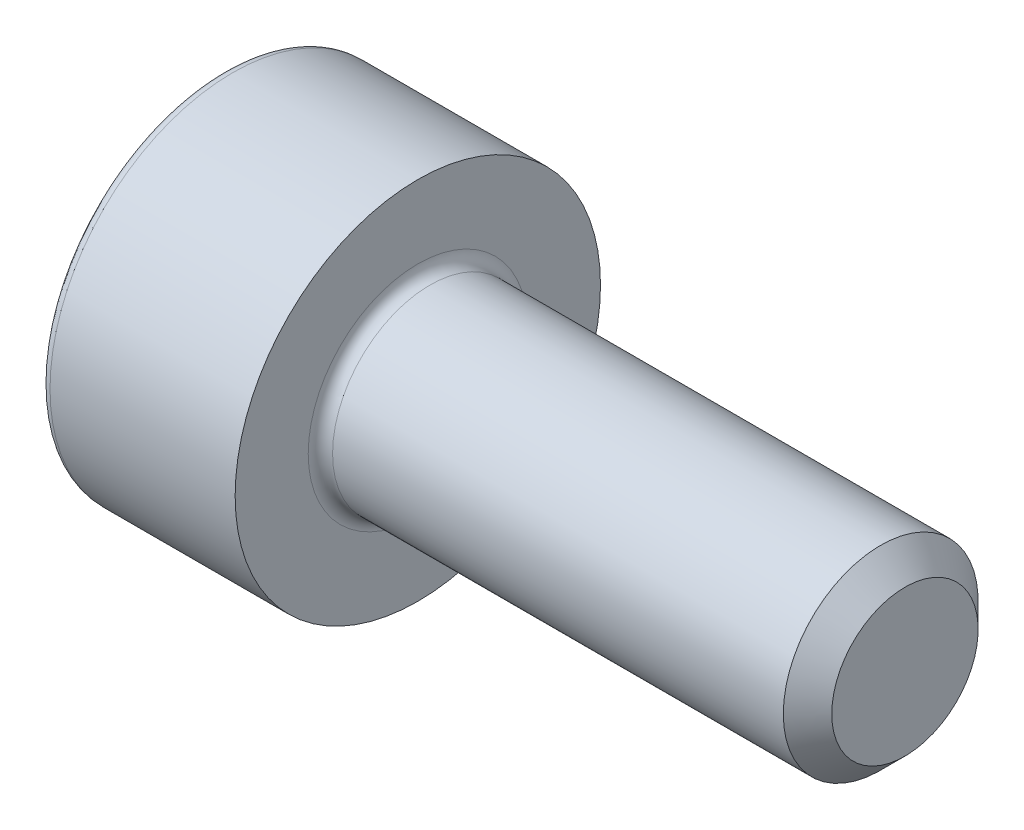
ISO-10303-21;
HEADER;
FILE_DESCRIPTION(('STEP AP214'),'2;1');
FILE_NAME('part.step','',(''),(''),'','','');
FILE_SCHEMA(('AUTOMOTIVE_DESIGN { 1 0 10303 214 1 1 1 1 }'));
ENDSEC;
DATA;
#1=APPLICATION_CONTEXT('core data for automotive mechanical design processes');
#2=APPLICATION_PROTOCOL_DEFINITION('international standard','automotive_design',2000,#1);
#3=PRODUCT_CONTEXT('',#1,'mechanical');
#4=PRODUCT('Part','Part','',(#3));
#5=PRODUCT_RELATED_PRODUCT_CATEGORY('part','',(#4));
#6=PRODUCT_DEFINITION_FORMATION('','',#4);
#7=PRODUCT_DEFINITION_CONTEXT('part definition',#1,'design');
#8=PRODUCT_DEFINITION('design','',#6,#7);
#9=PRODUCT_DEFINITION_SHAPE('','',#8);
#10=(LENGTH_UNIT() NAMED_UNIT(*) SI_UNIT(.MILLI.,.METRE.));
#11=(NAMED_UNIT(*) PLANE_ANGLE_UNIT() SI_UNIT($,.RADIAN.));
#12=(NAMED_UNIT(*) SI_UNIT($,.STERADIAN.) SOLID_ANGLE_UNIT());
#13=UNCERTAINTY_MEASURE_WITH_UNIT(LENGTH_MEASURE(1.E-05),#10,'distance_accuracy_value','');
#14=(GEOMETRIC_REPRESENTATION_CONTEXT(3) GLOBAL_UNCERTAINTY_ASSIGNED_CONTEXT((#13)) GLOBAL_UNIT_ASSIGNED_CONTEXT((#10,
#11,#12)) REPRESENTATION_CONTEXT('',''));
#15=CARTESIAN_POINT('',(0.,0.,0.));
#16=DIRECTION('',(0.,0.,1.));
#17=DIRECTION('',(1.,0.,0.));
#18=AXIS2_PLACEMENT_3D('',#15,#16,#17);
#19=CARTESIAN_POINT('',(0.7,0.433012701892219,-0.75));
#20=DIRECTION('',(-1.,0.,0.));
#21=DIRECTION('',(0.,0.,1.));
#22=AXIS2_PLACEMENT_3D('',#19,#20,#21);
#23=PLANE('',#22);
#24=DIRECTION('',(0.,-1.,0.));
#25=VECTOR('',#24,1.);
#26=CARTESIAN_POINT('',(0.7,0.43301270189222,0.75));
#27=LINE('',#26,#25);
#28=CARTESIAN_POINT('',(0.7,0.,0.75));
#29=VERTEX_POINT('',#28);
#30=CARTESIAN_POINT('',(0.7,-0.433012701892219,0.75));
#31=VERTEX_POINT('',#30);
#32=EDGE_CURVE('E166',#29,#31,#27,.T.);
#33=ORIENTED_EDGE('',*,*,#32,.F.);
#34=CARTESIAN_POINT('',(0.7,0.,0.));
#35=DIRECTION('',(-1.,0.,0.));
#36=DIRECTION('',(0.,0.,1.));
#37=AXIS2_PLACEMENT_3D('',#34,#35,#36);
#38=CIRCLE('',#37,0.75);
#39=CARTESIAN_POINT('',(0.7,-0.649519052838329,0.375));
#40=VERTEX_POINT('',#39);
#41=EDGE_CURVE('E11',#29,#40,#38,.F.);
#42=ORIENTED_EDGE('',*,*,#41,.T.);
#43=DIRECTION('',(0.,-0.5,-0.866025403784438));
#44=VECTOR('',#43,1.);
#45=CARTESIAN_POINT('',(0.7,-0.433012701892219,0.75));
#46=LINE('',#45,#44);
#47=EDGE_CURVE('E172',#31,#40,#46,.T.);
#48=ORIENTED_EDGE('',*,*,#47,.F.);
#49=EDGE_LOOP('',(#33,#42,#48));
#50=FACE_BOUND('',#49,.T.);
#51=ADVANCED_FACE('F39',(#50),#23,.T.);
#52=CARTESIAN_POINT('',(0.7,-0.866025403784439,0.));
#53=VERTEX_POINT('',#52);
#54=EDGE_CURVE('E171',#40,#53,#46,.T.);
#55=ORIENTED_EDGE('',*,*,#54,.F.);
#56=CARTESIAN_POINT('',(0.7,-0.649519052838329,-0.375));
#57=VERTEX_POINT('',#56);
#58=EDGE_CURVE('E47',#40,#57,#38,.F.);
#59=ORIENTED_EDGE('',*,*,#58,.T.);
#60=DIRECTION('',(0.,0.5,-0.866025403784439));
#61=VECTOR('',#60,1.);
#62=CARTESIAN_POINT('',(0.7,-0.866025403784439,0.));
#63=LINE('',#62,#61);
#64=EDGE_CURVE('E176',#53,#57,#63,.T.);
#65=ORIENTED_EDGE('',*,*,#64,.F.);
#66=EDGE_LOOP('',(#55,#59,#65));
#67=FACE_BOUND('',#66,.T.);
#68=ADVANCED_FACE('F122',(#67),#23,.T.);
#69=CARTESIAN_POINT('',(0.7,-0.43301270189222,-0.75));
#70=VERTEX_POINT('',#69);
#71=EDGE_CURVE('E175',#57,#70,#63,.T.);
#72=ORIENTED_EDGE('',*,*,#71,.F.);
#73=CARTESIAN_POINT('',(0.7,0.,-0.75));
#74=VERTEX_POINT('',#73);
#75=EDGE_CURVE('E233',#57,#74,#38,.F.);
#76=ORIENTED_EDGE('',*,*,#75,.T.);
#77=DIRECTION('',(0.,1.,0.));
#78=VECTOR('',#77,1.);
#79=CARTESIAN_POINT('',(0.7,-0.43301270189222,-0.75));
#80=LINE('',#79,#78);
#81=EDGE_CURVE('E180',#70,#74,#80,.T.);
#82=ORIENTED_EDGE('',*,*,#81,.F.);
#83=EDGE_LOOP('',(#72,#76,#82));
#84=FACE_BOUND('',#83,.T.);
#85=ADVANCED_FACE('F129',(#84),#23,.T.);
#86=CARTESIAN_POINT('',(0.7,0.43301270189222,-0.75));
#87=VERTEX_POINT('',#86);
#88=EDGE_CURVE('E179',#74,#87,#80,.T.);
#89=ORIENTED_EDGE('',*,*,#88,.F.);
#90=CARTESIAN_POINT('',(0.7,0.649519052838329,-0.375));
#91=VERTEX_POINT('',#90);
#92=EDGE_CURVE('E231',#74,#91,#38,.F.);
#93=ORIENTED_EDGE('',*,*,#92,.T.);
#94=DIRECTION('',(0.,0.5,0.866025403784439));
#95=VECTOR('',#94,1.);
#96=CARTESIAN_POINT('',(0.7,0.43301270189222,-0.75));
#97=LINE('',#96,#95);
#98=EDGE_CURVE('E156',#87,#91,#97,.T.);
#99=ORIENTED_EDGE('',*,*,#98,.F.);
#100=EDGE_LOOP('',(#89,#93,#99));
#101=FACE_BOUND('',#100,.T.);
#102=ADVANCED_FACE('F143',(#101),#23,.T.);
#103=CARTESIAN_POINT('',(0.7,0.866025403784439,0.));
#104=VERTEX_POINT('',#103);
#105=EDGE_CURVE('E195',#91,#104,#97,.T.);
#106=ORIENTED_EDGE('',*,*,#105,.F.);
#107=CARTESIAN_POINT('',(0.7,0.649519052838329,0.375));
#108=VERTEX_POINT('',#107);
#109=EDGE_CURVE('E48',#91,#108,#38,.F.);
#110=ORIENTED_EDGE('',*,*,#109,.T.);
#111=DIRECTION('',(0.,-0.5,0.866025403784439));
#112=VECTOR('',#111,1.);
#113=CARTESIAN_POINT('',(0.7,0.866025403784439,0.));
#114=LINE('',#113,#112);
#115=EDGE_CURVE('E155',#104,#108,#114,.T.);
#116=ORIENTED_EDGE('',*,*,#115,.F.);
#117=EDGE_LOOP('',(#106,#110,#116));
#118=FACE_BOUND('',#117,.T.);
#119=ADVANCED_FACE('F134',(#118),#23,.T.);
#120=CARTESIAN_POINT('',(0.7,0.43301270189222,0.75));
#121=VERTEX_POINT('',#120);
#122=EDGE_CURVE('E147',#108,#121,#114,.T.);
#123=ORIENTED_EDGE('',*,*,#122,.F.);
#124=CARTESIAN_POINT('',(0.7,0.,0.));
#125=DIRECTION('',(-1.,0.,0.));
#126=DIRECTION('',(0.,0.,1.));
#127=AXIS2_PLACEMENT_3D('',#124,#125,#126);
#128=CIRCLE('',#127,0.75);
#129=EDGE_CURVE('E149',#29,#108,#128,.T.);
#130=ORIENTED_EDGE('',*,*,#129,.F.);
#131=EDGE_CURVE('E151',#121,#29,#27,.T.);
#132=ORIENTED_EDGE('',*,*,#131,.F.);
#133=EDGE_LOOP('',(#123,#130,#132));
#134=FACE_BOUND('',#133,.T.);
#135=ADVANCED_FACE('F124',(#134),#23,.T.);
#136=CARTESIAN_POINT('',(0.,0.,0.));
#137=DIRECTION('',(1.,0.,0.));
#138=DIRECTION('',(0.,0.,-1.));
#139=AXIS2_PLACEMENT_3D('',#136,#137,#138);
#140=PLANE('',#139);
#141=CARTESIAN_POINT('',(0.,0.,0.));
#142=DIRECTION('',(1.,0.,0.));
#143=DIRECTION('',(0.,0.,-1.));
#144=AXIS2_PLACEMENT_3D('',#141,#142,#143);
#145=CIRCLE('',#144,1.42);
#146=CARTESIAN_POINT('',(0.,0.,-1.42));
#147=VERTEX_POINT('',#146);
#148=EDGE_CURVE('E225',#147,#147,#145,.F.);
#149=ORIENTED_EDGE('',*,*,#148,.T.);
#150=EDGE_LOOP('',(#149));
#151=FACE_BOUND('',#150,.T.);
#152=DIRECTION('',(0.,0.5,0.866025403784439));
#153=VECTOR('',#152,1.);
#154=CARTESIAN_POINT('',(0.,0.43301270189222,-0.75));
#155=LINE('',#154,#153);
#156=CARTESIAN_POINT('',(0.,0.43301270189222,-0.75));
#157=VERTEX_POINT('',#156);
#158=CARTESIAN_POINT('',(0.,0.866025403784439,0.));
#159=VERTEX_POINT('',#158);
#160=EDGE_CURVE('E184',#157,#159,#155,.T.);
#161=ORIENTED_EDGE('',*,*,#160,.T.);
#162=DIRECTION('',(0.,-0.5,0.866025403784439));
#163=VECTOR('',#162,1.);
#164=CARTESIAN_POINT('',(0.,0.866025403784439,0.));
#165=LINE('',#164,#163);
#166=CARTESIAN_POINT('',(0.,0.43301270189222,0.75));
#167=VERTEX_POINT('',#166);
#168=EDGE_CURVE('E186',#159,#167,#165,.T.);
#169=ORIENTED_EDGE('',*,*,#168,.T.);
#170=DIRECTION('',(0.,-1.,0.));
#171=VECTOR('',#170,1.);
#172=CARTESIAN_POINT('',(0.,0.43301270189222,0.75));
#173=LINE('',#172,#171);
#174=CARTESIAN_POINT('',(0.,-0.433012701892219,0.75));
#175=VERTEX_POINT('',#174);
#176=EDGE_CURVE('E188',#167,#175,#173,.T.);
#177=ORIENTED_EDGE('',*,*,#176,.T.);
#178=DIRECTION('',(0.,-0.5,-0.866025403784438));
#179=VECTOR('',#178,1.);
#180=CARTESIAN_POINT('',(0.,-0.433012701892219,0.75));
#181=LINE('',#180,#179);
#182=CARTESIAN_POINT('',(0.,-0.866025403784439,0.));
#183=VERTEX_POINT('',#182);
#184=EDGE_CURVE('E190',#175,#183,#181,.T.);
#185=ORIENTED_EDGE('',*,*,#184,.T.);
#186=DIRECTION('',(0.,0.5,-0.866025403784439));
#187=VECTOR('',#186,1.);
#188=CARTESIAN_POINT('',(0.,-0.866025403784439,0.));
#189=LINE('',#188,#187);
#190=CARTESIAN_POINT('',(0.,-0.43301270189222,-0.75));
#191=VERTEX_POINT('',#190);
#192=EDGE_CURVE('E192',#183,#191,#189,.T.);
#193=ORIENTED_EDGE('',*,*,#192,.T.);
#194=DIRECTION('',(0.,1.,0.));
#195=VECTOR('',#194,1.);
#196=CARTESIAN_POINT('',(0.,-0.43301270189222,-0.75));
#197=LINE('',#196,#195);
#198=EDGE_CURVE('E61',#191,#157,#197,.T.);
#199=ORIENTED_EDGE('',*,*,#198,.T.);
#200=EDGE_LOOP('',(#161,#169,#177,#185,#193,#199));
#201=FACE_BOUND('',#200,.T.);
#202=ADVANCED_FACE('F133',(#151,#201),#140,.F.);
#203=CARTESIAN_POINT('',(0.,0.,0.));
#204=DIRECTION('',(-1.,0.,0.));
#205=DIRECTION('',(0.,0.,1.));
#206=AXIS2_PLACEMENT_3D('',#203,#204,#205);
#207=CYLINDRICAL_SURFACE('',#206,1.5);
#208=CARTESIAN_POINT('',(0.08,0.,0.));
#209=DIRECTION('',(1.,0.,0.));
#210=DIRECTION('',(0.,0.,-1.));
#211=AXIS2_PLACEMENT_3D('',#208,#209,#210);
#212=CIRCLE('',#211,1.5);
#213=CARTESIAN_POINT('',(0.08,0.,-1.5));
#214=VERTEX_POINT('',#213);
#215=EDGE_CURVE('E227',#214,#214,#212,.T.);
#216=ORIENTED_EDGE('',*,*,#215,.T.);
#217=EDGE_LOOP('',(#216));
#218=FACE_BOUND('',#217,.T.);
#219=CARTESIAN_POINT('',(1.6,0.,0.));
#220=DIRECTION('',(-1.,0.,0.));
#221=DIRECTION('',(0.,0.,1.));
#222=AXIS2_PLACEMENT_3D('',#219,#220,#221);
#223=CIRCLE('',#222,1.5);
#224=CARTESIAN_POINT('',(1.6,0.,1.5));
#225=VERTEX_POINT('',#224);
#226=EDGE_CURVE('E216',#225,#225,#223,.T.);
#227=ORIENTED_EDGE('',*,*,#226,.T.);
#228=EDGE_LOOP('',(#227));
#229=FACE_BOUND('',#228,.T.);
#230=ADVANCED_FACE('F140',(#218,#229),#207,.T.);
#231=CARTESIAN_POINT('',(1.6,1.5,0.));
#232=DIRECTION('',(-1.,0.,0.));
#233=DIRECTION('',(0.,0.,1.));
#234=AXIS2_PLACEMENT_3D('',#231,#232,#233);
#235=PLANE('',#234);
#236=CARTESIAN_POINT('',(1.6,0.,0.));
#237=DIRECTION('',(-1.,0.,0.));
#238=DIRECTION('',(0.,0.,1.));
#239=AXIS2_PLACEMENT_3D('',#236,#237,#238);
#240=CIRCLE('',#239,0.9);
#241=CARTESIAN_POINT('',(1.6,0.,0.9));
#242=VERTEX_POINT('',#241);
#243=EDGE_CURVE('E219',#242,#242,#240,.T.);
#244=ORIENTED_EDGE('',*,*,#243,.T.);
#245=EDGE_LOOP('',(#244));
#246=FACE_BOUND('',#245,.T.);
#247=ORIENTED_EDGE('',*,*,#226,.F.);
#248=EDGE_LOOP('',(#247));
#249=FACE_BOUND('',#248,.T.);
#250=ADVANCED_FACE('F393',(#246,#249),#235,.F.);
#251=CARTESIAN_POINT('',(0.,0.,0.));
#252=DIRECTION('',(-1.,0.,0.));
#253=DIRECTION('',(0.,0.,1.));
#254=AXIS2_PLACEMENT_3D('',#251,#252,#253);
#255=CYLINDRICAL_SURFACE('',#254,0.8);
#256=CARTESIAN_POINT('',(1.7,0.,0.));
#257=DIRECTION('',(-1.,0.,0.));
#258=DIRECTION('',(0.,0.,1.));
#259=AXIS2_PLACEMENT_3D('',#256,#257,#258);
#260=CIRCLE('',#259,0.8);
#261=CARTESIAN_POINT('',(1.7,0.,0.8));
#262=VERTEX_POINT('',#261);
#263=EDGE_CURVE('E222',#262,#262,#260,.F.);
#264=ORIENTED_EDGE('',*,*,#263,.T.);
#265=EDGE_LOOP('',(#264));
#266=FACE_BOUND('',#265,.T.);
#267=CARTESIAN_POINT('',(5.401,0.,0.));
#268=DIRECTION('',(-1.,0.,0.));
#269=DIRECTION('',(0.,0.,1.));
#270=AXIS2_PLACEMENT_3D('',#267,#268,#269);
#271=CIRCLE('',#270,0.8);
#272=CARTESIAN_POINT('',(5.401,0.,0.8));
#273=VERTEX_POINT('',#272);
#274=EDGE_CURVE('E213',#273,#273,#271,.T.);
#275=ORIENTED_EDGE('',*,*,#274,.T.);
#276=EDGE_LOOP('',(#275));
#277=FACE_BOUND('',#276,.T.);
#278=ADVANCED_FACE('F384',(#266,#277),#255,.T.);
#279=CARTESIAN_POINT('',(5.6,0.,0.));
#280=DIRECTION('',(-1.,0.,0.));
#281=DIRECTION('',(0.,0.,1.));
#282=AXIS2_PLACEMENT_3D('',#279,#280,#281);
#283=CONICAL_SURFACE('',#282,0.601,0.785398163397452);
#284=ORIENTED_EDGE('',*,*,#274,.F.);
#285=EDGE_LOOP('',(#284));
#286=FACE_BOUND('',#285,.T.);
#287=CARTESIAN_POINT('',(5.6,0.,0.));
#288=DIRECTION('',(-1.,0.,0.));
#289=DIRECTION('',(0.,0.,1.));
#290=AXIS2_PLACEMENT_3D('',#287,#288,#289);
#291=CIRCLE('',#290,0.601);
#292=CARTESIAN_POINT('',(5.6,0.,0.601));
#293=VERTEX_POINT('',#292);
#294=EDGE_CURVE('E210',#293,#293,#291,.T.);
#295=ORIENTED_EDGE('',*,*,#294,.T.);
#296=EDGE_LOOP('',(#295));
#297=FACE_BOUND('',#296,.T.);
#298=ADVANCED_FACE('F373',(#286,#297),#283,.T.);
#299=CARTESIAN_POINT('',(5.6,0.601,0.));
#300=DIRECTION('',(-1.,0.,0.));
#301=DIRECTION('',(0.,0.,1.));
#302=AXIS2_PLACEMENT_3D('',#299,#300,#301);
#303=PLANE('',#302);
#304=ORIENTED_EDGE('',*,*,#294,.F.);
#305=EDGE_LOOP('',(#304));
#306=FACE_BOUND('',#305,.T.);
#307=ADVANCED_FACE('F363',(#306),#303,.F.);
#308=CARTESIAN_POINT('',(1.7,0.,0.));
#309=DIRECTION('',(-1.,0.,0.));
#310=DIRECTION('',(0.,0.,1.));
#311=AXIS2_PLACEMENT_3D('',#308,#309,#310);
#312=TOROIDAL_SURFACE('',#311,0.9,0.1);
#313=ORIENTED_EDGE('',*,*,#263,.F.);
#314=EDGE_LOOP('',(#313));
#315=FACE_BOUND('',#314,.T.);
#316=ORIENTED_EDGE('',*,*,#243,.F.);
#317=EDGE_LOOP('',(#316));
#318=FACE_BOUND('',#317,.T.);
#319=ADVANCED_FACE('F353',(#315,#318),#312,.F.);
#320=CARTESIAN_POINT('',(0.08,0.,0.));
#321=DIRECTION('',(1.,0.,0.));
#322=DIRECTION('',(0.,0.,-1.));
#323=AXIS2_PLACEMENT_3D('',#320,#321,#322);
#324=TOROIDAL_SURFACE('',#323,1.42,0.08);
#325=ORIENTED_EDGE('',*,*,#215,.F.);
#326=EDGE_LOOP('',(#325));
#327=FACE_BOUND('',#326,.T.);
#328=ORIENTED_EDGE('',*,*,#148,.F.);
#329=EDGE_LOOP('',(#328));
#330=FACE_BOUND('',#329,.T.);
#331=ADVANCED_FACE('F41',(#327,#330),#324,.T.);
#332=CARTESIAN_POINT('',(0.7,0.43301270189222,-0.75));
#333=DIRECTION('',(0.,-0.866025403784439,0.5));
#334=DIRECTION('',(0.,-0.5,-0.866025403784439));
#335=AXIS2_PLACEMENT_3D('',#332,#333,#334);
#336=PLANE('',#335);
#337=ORIENTED_EDGE('',*,*,#98,.T.);
#338=ORIENTED_EDGE('',*,*,#105,.T.);
#339=DIRECTION('',(-1.,0.,0.));
#340=VECTOR('',#339,1.);
#341=CARTESIAN_POINT('',(0.7,0.866025403784439,0.));
#342=LINE('',#341,#340);
#343=EDGE_CURVE('E163',#104,#159,#342,.T.);
#344=ORIENTED_EDGE('',*,*,#343,.T.);
#345=ORIENTED_EDGE('',*,*,#160,.F.);
#346=DIRECTION('',(-1.,0.,0.));
#347=VECTOR('',#346,1.);
#348=CARTESIAN_POINT('',(0.7,0.43301270189222,-0.75));
#349=LINE('',#348,#347);
#350=EDGE_CURVE('E183',#87,#157,#349,.T.);
#351=ORIENTED_EDGE('',*,*,#350,.F.);
#352=EDGE_LOOP('',(#337,#338,#344,#345,#351));
#353=FACE_BOUND('',#352,.T.);
#354=ADVANCED_FACE('F258',(#353),#336,.T.);
#355=CARTESIAN_POINT('',(0.7,0.866025403784439,0.));
#356=DIRECTION('',(0.,-0.866025403784439,-0.5));
#357=DIRECTION('',(0.,0.5,-0.866025403784439));
#358=AXIS2_PLACEMENT_3D('',#355,#356,#357);
#359=PLANE('',#358);
#360=ORIENTED_EDGE('',*,*,#115,.T.);
#361=ORIENTED_EDGE('',*,*,#122,.T.);
#362=DIRECTION('',(-1.,0.,0.));
#363=VECTOR('',#362,1.);
#364=CARTESIAN_POINT('',(0.7,0.43301270189222,0.75));
#365=LINE('',#364,#363);
#366=EDGE_CURVE('E207',#121,#167,#365,.T.);
#367=ORIENTED_EDGE('',*,*,#366,.T.);
#368=ORIENTED_EDGE('',*,*,#168,.F.);
#369=ORIENTED_EDGE('',*,*,#343,.F.);
#370=EDGE_LOOP('',(#360,#361,#367,#368,#369));
#371=FACE_BOUND('',#370,.T.);
#372=ADVANCED_FACE('F160',(#371),#359,.T.);
#373=CARTESIAN_POINT('',(0.7,0.43301270189222,0.75));
#374=DIRECTION('',(0.,0.,-1.));
#375=DIRECTION('',(0.,1.,0.));
#376=AXIS2_PLACEMENT_3D('',#373,#374,#375);
#377=PLANE('',#376);
#378=ORIENTED_EDGE('',*,*,#131,.T.);
#379=ORIENTED_EDGE('',*,*,#32,.T.);
#380=DIRECTION('',(-1.,0.,0.));
#381=VECTOR('',#380,1.);
#382=CARTESIAN_POINT('',(0.7,-0.433012701892219,0.75));
#383=LINE('',#382,#381);
#384=EDGE_CURVE('E204',#31,#175,#383,.T.);
#385=ORIENTED_EDGE('',*,*,#384,.T.);
#386=ORIENTED_EDGE('',*,*,#176,.F.);
#387=ORIENTED_EDGE('',*,*,#366,.F.);
#388=EDGE_LOOP('',(#378,#379,#385,#386,#387));
#389=FACE_BOUND('',#388,.T.);
#390=ADVANCED_FACE('F254',(#389),#377,.T.);
#391=CARTESIAN_POINT('',(0.7,-0.433012701892219,0.75));
#392=DIRECTION('',(0.,0.866025403784438,-0.5));
#393=DIRECTION('',(0.,0.5,0.866025403784438));
#394=AXIS2_PLACEMENT_3D('',#391,#392,#393);
#395=PLANE('',#394);
#396=ORIENTED_EDGE('',*,*,#47,.T.);
#397=ORIENTED_EDGE('',*,*,#54,.T.);
#398=DIRECTION('',(-1.,0.,0.));
#399=VECTOR('',#398,1.);
#400=CARTESIAN_POINT('',(0.7,-0.866025403784439,0.));
#401=LINE('',#400,#399);
#402=EDGE_CURVE('E201',#53,#183,#401,.T.);
#403=ORIENTED_EDGE('',*,*,#402,.T.);
#404=ORIENTED_EDGE('',*,*,#184,.F.);
#405=ORIENTED_EDGE('',*,*,#384,.F.);
#406=EDGE_LOOP('',(#396,#397,#403,#404,#405));
#407=FACE_BOUND('',#406,.T.);
#408=ADVANCED_FACE('F250',(#407),#395,.T.);
#409=CARTESIAN_POINT('',(0.7,-0.866025403784439,0.));
#410=DIRECTION('',(0.,0.866025403784439,0.5));
#411=DIRECTION('',(0.,-0.5,0.866025403784439));
#412=AXIS2_PLACEMENT_3D('',#409,#410,#411);
#413=PLANE('',#412);
#414=ORIENTED_EDGE('',*,*,#64,.T.);
#415=ORIENTED_EDGE('',*,*,#71,.T.);
#416=DIRECTION('',(-1.,0.,0.));
#417=VECTOR('',#416,1.);
#418=CARTESIAN_POINT('',(0.7,-0.43301270189222,-0.75));
#419=LINE('',#418,#417);
#420=EDGE_CURVE('E198',#70,#191,#419,.T.);
#421=ORIENTED_EDGE('',*,*,#420,.T.);
#422=ORIENTED_EDGE('',*,*,#192,.F.);
#423=ORIENTED_EDGE('',*,*,#402,.F.);
#424=EDGE_LOOP('',(#414,#415,#421,#422,#423));
#425=FACE_BOUND('',#424,.T.);
#426=ADVANCED_FACE('F117',(#425),#413,.T.);
#427=CARTESIAN_POINT('',(0.7,-0.43301270189222,-0.75));
#428=DIRECTION('',(0.,0.,1.));
#429=DIRECTION('',(0.,-1.,0.));
#430=AXIS2_PLACEMENT_3D('',#427,#428,#429);
#431=PLANE('',#430);
#432=ORIENTED_EDGE('',*,*,#81,.T.);
#433=ORIENTED_EDGE('',*,*,#88,.T.);
#434=ORIENTED_EDGE('',*,*,#350,.T.);
#435=ORIENTED_EDGE('',*,*,#198,.F.);
#436=ORIENTED_EDGE('',*,*,#420,.F.);
#437=EDGE_LOOP('',(#432,#433,#434,#435,#436));
#438=FACE_BOUND('',#437,.T.);
#439=ADVANCED_FACE('F112',(#438),#431,.T.);
#440=CARTESIAN_POINT('',(1.13301270189222,0.,0.));
#441=DIRECTION('',(-1.,0.,0.));
#442=DIRECTION('',(0.,0.,1.));
#443=AXIS2_PLACEMENT_3D('',#440,#441,#442);
#444=CONICAL_SURFACE('',#443,0.,1.04719755119659);
#445=ORIENTED_EDGE('',*,*,#129,.T.);
#446=ORIENTED_EDGE('',*,*,#109,.F.);
#447=ORIENTED_EDGE('',*,*,#92,.F.);
#448=ORIENTED_EDGE('',*,*,#75,.F.);
#449=ORIENTED_EDGE('',*,*,#58,.F.);
#450=ORIENTED_EDGE('',*,*,#41,.F.);
#451=EDGE_LOOP('',(#445,#446,#447,#448,#449,#450));
#452=FACE_BOUND('',#451,.T.);
#453=CARTESIAN_POINT('',(1.13301270189222,0.,0.));
#454=VERTEX_POINT('',#453);
#455=VERTEX_LOOP('',#454);
#456=FACE_BOUND('',#455,.T.);
#457=ADVANCED_FACE('F110',(#452,#456),#444,.F.);
#458=CLOSED_SHELL('',(#51,#68,#85,#102,#119,#135,#202,#230,#250,#278,#298,#307,#319,#331,#354,
#372,#390,#408,#426,#439,#457));
#459=MANIFOLD_SOLID_BREP('B2',#458);
#460=ADVANCED_BREP_SHAPE_REPRESENTATION('',(#18,#459),#14);
#461=SHAPE_DEFINITION_REPRESENTATION(#9,#460);
ENDSEC;
END-ISO-10303-21;
